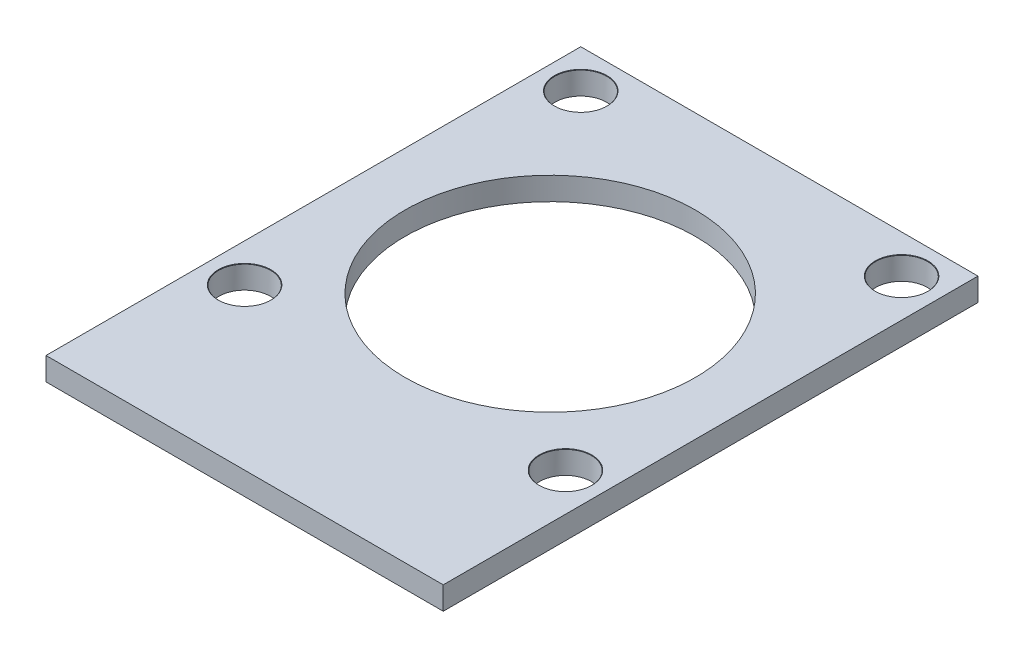
ISO-10303-21;
HEADER;
FILE_DESCRIPTION(('STEP AP214'),'2;1');
FILE_NAME('part.step','',(''),(''),'','','');
FILE_SCHEMA(('AUTOMOTIVE_DESIGN { 1 0 10303 214 1 1 1 1 }'));
ENDSEC;
DATA;
#1=APPLICATION_CONTEXT('core data for automotive mechanical design processes');
#2=APPLICATION_PROTOCOL_DEFINITION('international standard','automotive_design',2000,#1);
#3=PRODUCT_CONTEXT('',#1,'mechanical');
#4=PRODUCT('Part','Part','',(#3));
#5=PRODUCT_RELATED_PRODUCT_CATEGORY('part','',(#4));
#6=PRODUCT_DEFINITION_FORMATION('','',#4);
#7=PRODUCT_DEFINITION_CONTEXT('part definition',#1,'design');
#8=PRODUCT_DEFINITION('design','',#6,#7);
#9=PRODUCT_DEFINITION_SHAPE('','',#8);
#10=(LENGTH_UNIT() NAMED_UNIT(*) SI_UNIT(.MILLI.,.METRE.));
#11=(NAMED_UNIT(*) PLANE_ANGLE_UNIT() SI_UNIT($,.RADIAN.));
#12=(NAMED_UNIT(*) SI_UNIT($,.STERADIAN.) SOLID_ANGLE_UNIT());
#13=UNCERTAINTY_MEASURE_WITH_UNIT(LENGTH_MEASURE(1.E-05),#10,'distance_accuracy_value','');
#14=(GEOMETRIC_REPRESENTATION_CONTEXT(3) GLOBAL_UNCERTAINTY_ASSIGNED_CONTEXT((#13)) GLOBAL_UNIT_ASSIGNED_CONTEXT((#10,
#11,#12)) REPRESENTATION_CONTEXT('',''));
#15=CARTESIAN_POINT('',(0.,0.,0.));
#16=DIRECTION('',(0.,0.,1.));
#17=DIRECTION('',(1.,0.,0.));
#18=AXIS2_PLACEMENT_3D('',#15,#16,#17);
#19=CARTESIAN_POINT('',(0.,1.5,0.));
#20=DIRECTION('',(1.,0.,0.));
#21=DIRECTION('',(0.,0.,-1.));
#22=AXIS2_PLACEMENT_3D('',#19,#20,#21);
#23=PLANE('',#22);
#24=DIRECTION('',(0.,0.,1.));
#25=VECTOR('',#24,1.);
#26=CARTESIAN_POINT('',(0.,0.,0.));
#27=LINE('',#26,#25);
#28=CARTESIAN_POINT('',(0.,0.,-35.));
#29=VERTEX_POINT('',#28);
#30=CARTESIAN_POINT('',(0.,0.,0.));
#31=VERTEX_POINT('',#30);
#32=EDGE_CURVE('E99',#29,#31,#27,.T.);
#33=ORIENTED_EDGE('',*,*,#32,.T.);
#34=DIRECTION('',(0.,-1.,0.));
#35=VECTOR('',#34,1.);
#36=CARTESIAN_POINT('',(0.,1.5,0.));
#37=LINE('',#36,#35);
#38=CARTESIAN_POINT('',(0.,1.5,0.));
#39=VERTEX_POINT('',#38);
#40=EDGE_CURVE('E11',#39,#31,#37,.T.);
#41=ORIENTED_EDGE('',*,*,#40,.F.);
#42=DIRECTION('',(0.,0.,1.));
#43=VECTOR('',#42,1.);
#44=CARTESIAN_POINT('',(0.,1.5,0.));
#45=LINE('',#44,#43);
#46=CARTESIAN_POINT('',(0.,1.5,-35.));
#47=VERTEX_POINT('',#46);
#48=EDGE_CURVE('E86',#47,#39,#45,.T.);
#49=ORIENTED_EDGE('',*,*,#48,.F.);
#50=DIRECTION('',(0.,-1.,0.));
#51=VECTOR('',#50,1.);
#52=CARTESIAN_POINT('',(0.,1.5,-35.));
#53=LINE('',#52,#51);
#54=EDGE_CURVE('E95',#47,#29,#53,.T.);
#55=ORIENTED_EDGE('',*,*,#54,.T.);
#56=EDGE_LOOP('',(#33,#41,#49,#55));
#57=FACE_BOUND('',#56,.T.);
#58=ADVANCED_FACE('F33',(#57),#23,.F.);
#59=CARTESIAN_POINT('',(0.,1.5,0.));
#60=DIRECTION('',(0.,0.,-1.));
#61=DIRECTION('',(-1.,0.,0.));
#62=AXIS2_PLACEMENT_3D('',#59,#60,#61);
#63=PLANE('',#62);
#64=DIRECTION('',(1.,0.,0.));
#65=VECTOR('',#64,1.);
#66=CARTESIAN_POINT('',(0.,0.,0.));
#67=LINE('',#66,#65);
#68=CARTESIAN_POINT('',(26.,0.,0.));
#69=VERTEX_POINT('',#68);
#70=EDGE_CURVE('E90',#31,#69,#67,.T.);
#71=ORIENTED_EDGE('',*,*,#70,.T.);
#72=DIRECTION('',(0.,-1.,0.));
#73=VECTOR('',#72,1.);
#74=CARTESIAN_POINT('',(26.,1.5,0.));
#75=LINE('',#74,#73);
#76=CARTESIAN_POINT('',(26.,1.5,0.));
#77=VERTEX_POINT('',#76);
#78=EDGE_CURVE('E42',#77,#69,#75,.T.);
#79=ORIENTED_EDGE('',*,*,#78,.F.);
#80=DIRECTION('',(1.,0.,0.));
#81=VECTOR('',#80,1.);
#82=CARTESIAN_POINT('',(0.,1.5,0.));
#83=LINE('',#82,#81);
#84=EDGE_CURVE('E81',#39,#77,#83,.T.);
#85=ORIENTED_EDGE('',*,*,#84,.F.);
#86=ORIENTED_EDGE('',*,*,#40,.T.);
#87=EDGE_LOOP('',(#71,#79,#85,#86));
#88=FACE_BOUND('',#87,.T.);
#89=ADVANCED_FACE('F89',(#88),#63,.F.);
#90=CARTESIAN_POINT('',(26.,1.5,0.));
#91=DIRECTION('',(-1.,0.,0.));
#92=DIRECTION('',(0.,0.,1.));
#93=AXIS2_PLACEMENT_3D('',#90,#91,#92);
#94=PLANE('',#93);
#95=DIRECTION('',(0.,0.,-1.));
#96=VECTOR('',#95,1.);
#97=CARTESIAN_POINT('',(26.,0.,0.));
#98=LINE('',#97,#96);
#99=CARTESIAN_POINT('',(26.,0.,-35.));
#100=VERTEX_POINT('',#99);
#101=EDGE_CURVE('E68',#69,#100,#98,.T.);
#102=ORIENTED_EDGE('',*,*,#101,.T.);
#103=DIRECTION('',(0.,-1.,0.));
#104=VECTOR('',#103,1.);
#105=CARTESIAN_POINT('',(26.,1.5,-35.));
#106=LINE('',#105,#104);
#107=CARTESIAN_POINT('',(26.,1.5,-35.));
#108=VERTEX_POINT('',#107);
#109=EDGE_CURVE('E91',#108,#100,#106,.T.);
#110=ORIENTED_EDGE('',*,*,#109,.F.);
#111=DIRECTION('',(0.,0.,-1.));
#112=VECTOR('',#111,1.);
#113=CARTESIAN_POINT('',(26.,1.5,0.));
#114=LINE('',#113,#112);
#115=EDGE_CURVE('E84',#77,#108,#114,.T.);
#116=ORIENTED_EDGE('',*,*,#115,.F.);
#117=ORIENTED_EDGE('',*,*,#78,.T.);
#118=EDGE_LOOP('',(#102,#110,#116,#117));
#119=FACE_BOUND('',#118,.T.);
#120=ADVANCED_FACE('F93',(#119),#94,.F.);
#121=CARTESIAN_POINT('',(0.,1.5,-35.));
#122=DIRECTION('',(0.,0.,1.));
#123=DIRECTION('',(1.,0.,0.));
#124=AXIS2_PLACEMENT_3D('',#121,#122,#123);
#125=PLANE('',#124);
#126=DIRECTION('',(-1.,0.,0.));
#127=VECTOR('',#126,1.);
#128=CARTESIAN_POINT('',(0.,0.,-35.));
#129=LINE('',#128,#127);
#130=EDGE_CURVE('E74',#100,#29,#129,.T.);
#131=ORIENTED_EDGE('',*,*,#130,.T.);
#132=ORIENTED_EDGE('',*,*,#54,.F.);
#133=DIRECTION('',(-1.,0.,0.));
#134=VECTOR('',#133,1.);
#135=CARTESIAN_POINT('',(0.,1.5,-35.));
#136=LINE('',#135,#134);
#137=EDGE_CURVE('E51',#108,#47,#136,.T.);
#138=ORIENTED_EDGE('',*,*,#137,.F.);
#139=ORIENTED_EDGE('',*,*,#109,.T.);
#140=EDGE_LOOP('',(#131,#132,#138,#139));
#141=FACE_BOUND('',#140,.T.);
#142=ADVANCED_FACE('F150',(#141),#125,.F.);
#143=CARTESIAN_POINT('',(0.,1.5,0.));
#144=DIRECTION('',(0.,-1.,0.));
#145=DIRECTION('',(0.,0.,-1.));
#146=AXIS2_PLACEMENT_3D('',#143,#144,#145);
#147=PLANE('',#146);
#148=CARTESIAN_POINT('',(13.,1.5,-20.));
#149=DIRECTION('',(0.,1.,0.));
#150=DIRECTION('',(0.,0.,1.));
#151=AXIS2_PLACEMENT_3D('',#148,#149,#150);
#152=CIRCLE('',#151,9.5);
#153=CARTESIAN_POINT('',(13.,1.5,-10.5));
#154=VERTEX_POINT('',#153);
#155=EDGE_CURVE('E281',#154,#154,#152,.T.);
#156=ORIENTED_EDGE('',*,*,#155,.F.);
#157=EDGE_LOOP('',(#156));
#158=FACE_BOUND('',#157,.T.);
#159=CARTESIAN_POINT('',(2.5,1.5,-32.5));
#160=DIRECTION('',(0.,1.,0.));
#161=DIRECTION('',(0.,0.,1.));
#162=AXIS2_PLACEMENT_3D('',#159,#160,#161);
#163=CIRCLE('',#162,1.725);
#164=CARTESIAN_POINT('',(2.5,1.5,-30.775));
#165=VERTEX_POINT('',#164);
#166=EDGE_CURVE('E283',#165,#165,#163,.T.);
#167=ORIENTED_EDGE('',*,*,#166,.F.);
#168=EDGE_LOOP('',(#167));
#169=FACE_BOUND('',#168,.T.);
#170=CARTESIAN_POINT('',(2.5,1.5,-10.5));
#171=DIRECTION('',(0.,1.,0.));
#172=DIRECTION('',(0.,0.,1.));
#173=AXIS2_PLACEMENT_3D('',#170,#171,#172);
#174=CIRCLE('',#173,1.725);
#175=CARTESIAN_POINT('',(2.5,1.5,-8.775));
#176=VERTEX_POINT('',#175);
#177=EDGE_CURVE('E124',#176,#176,#174,.T.);
#178=ORIENTED_EDGE('',*,*,#177,.F.);
#179=EDGE_LOOP('',(#178));
#180=FACE_BOUND('',#179,.T.);
#181=CARTESIAN_POINT('',(23.5,1.5,-10.5));
#182=DIRECTION('',(0.,1.,0.));
#183=DIRECTION('',(0.,0.,1.));
#184=AXIS2_PLACEMENT_3D('',#181,#182,#183);
#185=CIRCLE('',#184,1.725);
#186=CARTESIAN_POINT('',(23.5,1.5,-8.775));
#187=VERTEX_POINT('',#186);
#188=EDGE_CURVE('E117',#187,#187,#185,.T.);
#189=ORIENTED_EDGE('',*,*,#188,.F.);
#190=EDGE_LOOP('',(#189));
#191=FACE_BOUND('',#190,.T.);
#192=CARTESIAN_POINT('',(23.5,1.5,-32.5));
#193=DIRECTION('',(0.,1.,0.));
#194=DIRECTION('',(0.,0.,1.));
#195=AXIS2_PLACEMENT_3D('',#192,#193,#194);
#196=CIRCLE('',#195,1.725);
#197=CARTESIAN_POINT('',(23.5,1.5,-30.775));
#198=VERTEX_POINT('',#197);
#199=EDGE_CURVE('E113',#198,#198,#196,.T.);
#200=ORIENTED_EDGE('',*,*,#199,.F.);
#201=EDGE_LOOP('',(#200));
#202=FACE_BOUND('',#201,.T.);
#203=ORIENTED_EDGE('',*,*,#48,.T.);
#204=ORIENTED_EDGE('',*,*,#84,.T.);
#205=ORIENTED_EDGE('',*,*,#115,.T.);
#206=ORIENTED_EDGE('',*,*,#137,.T.);
#207=EDGE_LOOP('',(#203,#204,#205,#206));
#208=FACE_BOUND('',#207,.T.);
#209=ADVANCED_FACE('F82',(#158,#169,#180,#191,#202,#208),#147,.F.);
#210=CARTESIAN_POINT('',(0.,0.,0.));
#211=DIRECTION('',(0.,-1.,0.));
#212=DIRECTION('',(0.,0.,-1.));
#213=AXIS2_PLACEMENT_3D('',#210,#211,#212);
#214=PLANE('',#213);
#215=CARTESIAN_POINT('',(13.,0.,-20.));
#216=DIRECTION('',(0.,1.,0.));
#217=DIRECTION('',(0.,0.,1.));
#218=AXIS2_PLACEMENT_3D('',#215,#216,#217);
#219=CIRCLE('',#218,9.5);
#220=CARTESIAN_POINT('',(13.,0.,-10.5));
#221=VERTEX_POINT('',#220);
#222=EDGE_CURVE('E279',#221,#221,#219,.T.);
#223=ORIENTED_EDGE('',*,*,#222,.T.);
#224=EDGE_LOOP('',(#223));
#225=FACE_BOUND('',#224,.T.);
#226=CARTESIAN_POINT('',(2.5,0.,-32.5));
#227=DIRECTION('',(0.,-1.,0.));
#228=DIRECTION('',(0.,0.,-1.));
#229=AXIS2_PLACEMENT_3D('',#226,#227,#228);
#230=CIRCLE('',#229,1.69999999999999);
#231=CARTESIAN_POINT('',(2.5,0.,-34.2));
#232=VERTEX_POINT('',#231);
#233=EDGE_CURVE('E36',#232,#232,#230,.T.);
#234=ORIENTED_EDGE('',*,*,#233,.F.);
#235=EDGE_LOOP('',(#234));
#236=FACE_BOUND('',#235,.T.);
#237=CARTESIAN_POINT('',(2.5,0.,-10.5));
#238=DIRECTION('',(0.,-1.,0.));
#239=DIRECTION('',(0.,0.,-1.));
#240=AXIS2_PLACEMENT_3D('',#237,#238,#239);
#241=CIRCLE('',#240,1.69999999999999);
#242=CARTESIAN_POINT('',(2.5,0.,-12.2));
#243=VERTEX_POINT('',#242);
#244=EDGE_CURVE('E115',#243,#243,#241,.T.);
#245=ORIENTED_EDGE('',*,*,#244,.F.);
#246=EDGE_LOOP('',(#245));
#247=FACE_BOUND('',#246,.T.);
#248=CARTESIAN_POINT('',(23.5,0.,-10.5));
#249=DIRECTION('',(0.,-1.,0.));
#250=DIRECTION('',(0.,0.,-1.));
#251=AXIS2_PLACEMENT_3D('',#248,#249,#250);
#252=CIRCLE('',#251,1.69999999999999);
#253=CARTESIAN_POINT('',(23.5,0.,-12.2));
#254=VERTEX_POINT('',#253);
#255=EDGE_CURVE('E111',#254,#254,#252,.T.);
#256=ORIENTED_EDGE('',*,*,#255,.F.);
#257=EDGE_LOOP('',(#256));
#258=FACE_BOUND('',#257,.T.);
#259=CARTESIAN_POINT('',(23.5,0.,-32.5));
#260=DIRECTION('',(0.,-1.,0.));
#261=DIRECTION('',(0.,0.,-1.));
#262=AXIS2_PLACEMENT_3D('',#259,#260,#261);
#263=CIRCLE('',#262,1.69999999999999);
#264=CARTESIAN_POINT('',(23.5,0.,-34.2));
#265=VERTEX_POINT('',#264);
#266=EDGE_CURVE('E102',#265,#265,#263,.T.);
#267=ORIENTED_EDGE('',*,*,#266,.F.);
#268=EDGE_LOOP('',(#267));
#269=FACE_BOUND('',#268,.T.);
#270=ORIENTED_EDGE('',*,*,#32,.F.);
#271=ORIENTED_EDGE('',*,*,#130,.F.);
#272=ORIENTED_EDGE('',*,*,#101,.F.);
#273=ORIENTED_EDGE('',*,*,#70,.F.);
#274=EDGE_LOOP('',(#270,#271,#272,#273));
#275=FACE_BOUND('',#274,.T.);
#276=ADVANCED_FACE('F149',(#225,#236,#247,#258,#269,#275),#214,.T.);
#277=CARTESIAN_POINT('',(23.5,1.5,-32.5));
#278=DIRECTION('',(0.,1.,0.));
#279=DIRECTION('',(0.,0.,1.));
#280=AXIS2_PLACEMENT_3D('',#277,#278,#279);
#281=CYLINDRICAL_SURFACE('',#280,1.69999999999999);
#282=ORIENTED_EDGE('',*,*,#266,.T.);
#283=EDGE_LOOP('',(#282));
#284=FACE_BOUND('',#283,.T.);
#285=CARTESIAN_POINT('',(23.5,1.47499999999997,-32.5));
#286=DIRECTION('',(0.,1.,0.));
#287=DIRECTION('',(0.,0.,1.));
#288=AXIS2_PLACEMENT_3D('',#285,#286,#287);
#289=CIRCLE('',#288,1.69999999999999);
#290=CARTESIAN_POINT('',(23.5,1.47499999999997,-30.8));
#291=VERTEX_POINT('',#290);
#292=EDGE_CURVE('E110',#291,#291,#289,.T.);
#293=ORIENTED_EDGE('',*,*,#292,.T.);
#294=EDGE_LOOP('',(#293));
#295=FACE_BOUND('',#294,.T.);
#296=ADVANCED_FACE('F139',(#284,#295),#281,.F.);
#297=CARTESIAN_POINT('',(23.5,1.5,-32.5));
#298=DIRECTION('',(0.,1.,0.));
#299=DIRECTION('',(0.,0.,1.));
#300=AXIS2_PLACEMENT_3D('',#297,#298,#299);
#301=CONICAL_SURFACE('',#300,1.725,0.785398163397136);
#302=ORIENTED_EDGE('',*,*,#292,.F.);
#303=EDGE_LOOP('',(#302));
#304=FACE_BOUND('',#303,.T.);
#305=ORIENTED_EDGE('',*,*,#199,.T.);
#306=EDGE_LOOP('',(#305));
#307=FACE_BOUND('',#306,.T.);
#308=ADVANCED_FACE('F141',(#304,#307),#301,.F.);
#309=CARTESIAN_POINT('',(23.5,1.5,-10.5));
#310=DIRECTION('',(0.,1.,0.));
#311=DIRECTION('',(0.,0.,1.));
#312=AXIS2_PLACEMENT_3D('',#309,#310,#311);
#313=CYLINDRICAL_SURFACE('',#312,1.69999999999999);
#314=ORIENTED_EDGE('',*,*,#255,.T.);
#315=EDGE_LOOP('',(#314));
#316=FACE_BOUND('',#315,.T.);
#317=CARTESIAN_POINT('',(23.5,1.47499999999997,-10.5));
#318=DIRECTION('',(0.,1.,0.));
#319=DIRECTION('',(0.,0.,1.));
#320=AXIS2_PLACEMENT_3D('',#317,#318,#319);
#321=CIRCLE('',#320,1.69999999999999);
#322=CARTESIAN_POINT('',(23.5,1.47499999999997,-8.80000000000001));
#323=VERTEX_POINT('',#322);
#324=EDGE_CURVE('E114',#323,#323,#321,.T.);
#325=ORIENTED_EDGE('',*,*,#324,.T.);
#326=EDGE_LOOP('',(#325));
#327=FACE_BOUND('',#326,.T.);
#328=ADVANCED_FACE('F144',(#316,#327),#313,.F.);
#329=CARTESIAN_POINT('',(23.5,1.5,-10.5));
#330=DIRECTION('',(0.,1.,0.));
#331=DIRECTION('',(0.,0.,1.));
#332=AXIS2_PLACEMENT_3D('',#329,#330,#331);
#333=CONICAL_SURFACE('',#332,1.725,0.785398163397136);
#334=ORIENTED_EDGE('',*,*,#324,.F.);
#335=EDGE_LOOP('',(#334));
#336=FACE_BOUND('',#335,.T.);
#337=ORIENTED_EDGE('',*,*,#188,.T.);
#338=EDGE_LOOP('',(#337));
#339=FACE_BOUND('',#338,.T.);
#340=ADVANCED_FACE('F205',(#336,#339),#333,.F.);
#341=CARTESIAN_POINT('',(2.5,1.5,-10.5));
#342=DIRECTION('',(0.,1.,0.));
#343=DIRECTION('',(0.,0.,1.));
#344=AXIS2_PLACEMENT_3D('',#341,#342,#343);
#345=CYLINDRICAL_SURFACE('',#344,1.69999999999999);
#346=ORIENTED_EDGE('',*,*,#244,.T.);
#347=EDGE_LOOP('',(#346));
#348=FACE_BOUND('',#347,.T.);
#349=CARTESIAN_POINT('',(2.5,1.47499999999997,-10.5));
#350=DIRECTION('',(0.,1.,0.));
#351=DIRECTION('',(0.,0.,1.));
#352=AXIS2_PLACEMENT_3D('',#349,#350,#351);
#353=CIRCLE('',#352,1.69999999999999);
#354=CARTESIAN_POINT('',(2.5,1.47499999999997,-8.80000000000001));
#355=VERTEX_POINT('',#354);
#356=EDGE_CURVE('E118',#355,#355,#353,.T.);
#357=ORIENTED_EDGE('',*,*,#356,.T.);
#358=EDGE_LOOP('',(#357));
#359=FACE_BOUND('',#358,.T.);
#360=ADVANCED_FACE('F215',(#348,#359),#345,.F.);
#361=CARTESIAN_POINT('',(2.5,1.5,-10.5));
#362=DIRECTION('',(0.,1.,0.));
#363=DIRECTION('',(0.,0.,1.));
#364=AXIS2_PLACEMENT_3D('',#361,#362,#363);
#365=CONICAL_SURFACE('',#364,1.725,0.785398163397136);
#366=ORIENTED_EDGE('',*,*,#356,.F.);
#367=EDGE_LOOP('',(#366));
#368=FACE_BOUND('',#367,.T.);
#369=ORIENTED_EDGE('',*,*,#177,.T.);
#370=EDGE_LOOP('',(#369));
#371=FACE_BOUND('',#370,.T.);
#372=ADVANCED_FACE('F225',(#368,#371),#365,.F.);
#373=CARTESIAN_POINT('',(2.5,1.5,-32.5));
#374=DIRECTION('',(0.,1.,0.));
#375=DIRECTION('',(0.,0.,1.));
#376=AXIS2_PLACEMENT_3D('',#373,#374,#375);
#377=CYLINDRICAL_SURFACE('',#376,1.69999999999999);
#378=ORIENTED_EDGE('',*,*,#233,.T.);
#379=EDGE_LOOP('',(#378));
#380=FACE_BOUND('',#379,.T.);
#381=CARTESIAN_POINT('',(2.5,1.47499999999997,-32.5));
#382=DIRECTION('',(0.,1.,0.));
#383=DIRECTION('',(0.,0.,1.));
#384=AXIS2_PLACEMENT_3D('',#381,#382,#383);
#385=CIRCLE('',#384,1.69999999999999);
#386=CARTESIAN_POINT('',(2.5,1.47499999999997,-30.8));
#387=VERTEX_POINT('',#386);
#388=EDGE_CURVE('E287',#387,#387,#385,.T.);
#389=ORIENTED_EDGE('',*,*,#388,.T.);
#390=EDGE_LOOP('',(#389));
#391=FACE_BOUND('',#390,.T.);
#392=ADVANCED_FACE('F234',(#380,#391),#377,.F.);
#393=CARTESIAN_POINT('',(2.5,1.5,-32.5));
#394=DIRECTION('',(0.,1.,0.));
#395=DIRECTION('',(0.,0.,1.));
#396=AXIS2_PLACEMENT_3D('',#393,#394,#395);
#397=CONICAL_SURFACE('',#396,1.725,0.785398163397136);
#398=ORIENTED_EDGE('',*,*,#388,.F.);
#399=EDGE_LOOP('',(#398));
#400=FACE_BOUND('',#399,.T.);
#401=ORIENTED_EDGE('',*,*,#166,.T.);
#402=EDGE_LOOP('',(#401));
#403=FACE_BOUND('',#402,.T.);
#404=ADVANCED_FACE('F244',(#400,#403),#397,.F.);
#405=CARTESIAN_POINT('',(13.,0.,-20.));
#406=DIRECTION('',(0.,1.,0.));
#407=DIRECTION('',(0.,0.,1.));
#408=AXIS2_PLACEMENT_3D('',#405,#406,#407);
#409=CYLINDRICAL_SURFACE('',#408,9.5);
#410=ORIENTED_EDGE('',*,*,#222,.F.);
#411=EDGE_LOOP('',(#410));
#412=FACE_BOUND('',#411,.T.);
#413=ORIENTED_EDGE('',*,*,#155,.T.);
#414=EDGE_LOOP('',(#413));
#415=FACE_BOUND('',#414,.T.);
#416=ADVANCED_FACE('F253',(#412,#415),#409,.F.);
#417=CLOSED_SHELL('',(#58,#89,#120,#142,#209,#276,#296,#308,#328,#340,#360,#372,#392,#404,#416));
#418=MANIFOLD_SOLID_BREP('B2',#417);
#419=ADVANCED_BREP_SHAPE_REPRESENTATION('',(#18,#418),#14);
#420=SHAPE_DEFINITION_REPRESENTATION(#9,#419);
ENDSEC;
END-ISO-10303-21;
